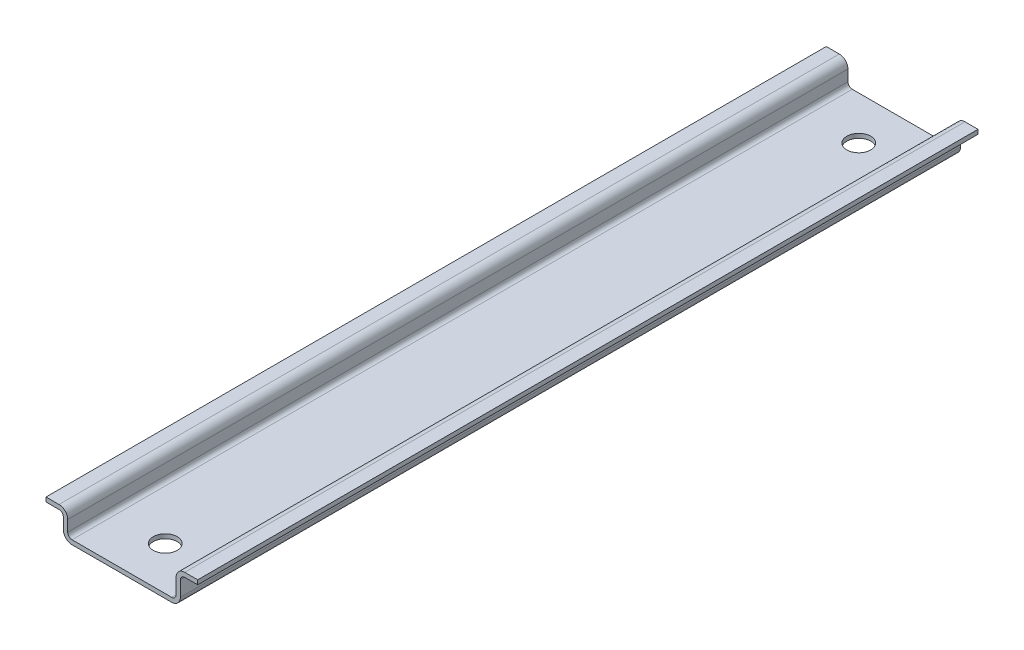
ISO-10303-21;
HEADER;
FILE_DESCRIPTION(('STEP AP214'),'2;1');
FILE_NAME('part.step','',(''),(''),'','','');
FILE_SCHEMA(('AUTOMOTIVE_DESIGN { 1 0 10303 214 1 1 1 1 }'));
ENDSEC;
DATA;
#1=APPLICATION_CONTEXT('core data for automotive mechanical design processes');
#2=APPLICATION_PROTOCOL_DEFINITION('international standard','automotive_design',2000,#1);
#3=PRODUCT_CONTEXT('',#1,'mechanical');
#4=PRODUCT('Part','Part','',(#3));
#5=PRODUCT_RELATED_PRODUCT_CATEGORY('part','',(#4));
#6=PRODUCT_DEFINITION_FORMATION('','',#4);
#7=PRODUCT_DEFINITION_CONTEXT('part definition',#1,'design');
#8=PRODUCT_DEFINITION('design','',#6,#7);
#9=PRODUCT_DEFINITION_SHAPE('','',#8);
#10=(LENGTH_UNIT() NAMED_UNIT(*) SI_UNIT(.MILLI.,.METRE.));
#11=(NAMED_UNIT(*) PLANE_ANGLE_UNIT() SI_UNIT($,.RADIAN.));
#12=(NAMED_UNIT(*) SI_UNIT($,.STERADIAN.) SOLID_ANGLE_UNIT());
#13=UNCERTAINTY_MEASURE_WITH_UNIT(LENGTH_MEASURE(1.E-05),#10,'distance_accuracy_value','');
#14=(GEOMETRIC_REPRESENTATION_CONTEXT(3) GLOBAL_UNCERTAINTY_ASSIGNED_CONTEXT((#13)) GLOBAL_UNIT_ASSIGNED_CONTEXT((#10,
#11,#12)) REPRESENTATION_CONTEXT('',''));
#15=CARTESIAN_POINT('',(0.,0.,0.));
#16=DIRECTION('',(0.,0.,1.));
#17=DIRECTION('',(1.,0.,0.));
#18=AXIS2_PLACEMENT_3D('',#15,#16,#17);
#19=CARTESIAN_POINT('',(-4.,5.54454071771809,180.));
#20=DIRECTION('',(1.,0.,0.));
#21=DIRECTION('',(0.,0.,-1.));
#22=AXIS2_PLACEMENT_3D('',#19,#20,#21);
#23=PLANE('',#22);
#24=DIRECTION('',(0.,-1.,0.));
#25=VECTOR('',#24,1.);
#26=CARTESIAN_POINT('',(-4.,5.54454071771809,0.));
#27=LINE('',#26,#25);
#28=CARTESIAN_POINT('',(-4.,6.54454071771809,0.));
#29=VERTEX_POINT('',#28);
#30=CARTESIAN_POINT('',(-4.,5.54454071771809,0.));
#31=VERTEX_POINT('',#30);
#32=EDGE_CURVE('E200',#29,#31,#27,.T.);
#33=ORIENTED_EDGE('',*,*,#32,.T.);
#34=DIRECTION('',(0.,0.,-1.));
#35=VECTOR('',#34,1.);
#36=CARTESIAN_POINT('',(-4.,5.54454071771809,180.));
#37=LINE('',#36,#35);
#38=CARTESIAN_POINT('',(-4.,5.54454071771809,180.));
#39=VERTEX_POINT('',#38);
#40=EDGE_CURVE('E11',#39,#31,#37,.T.);
#41=ORIENTED_EDGE('',*,*,#40,.F.);
#42=DIRECTION('',(0.,-1.,0.));
#43=VECTOR('',#42,1.);
#44=CARTESIAN_POINT('',(-4.,5.54454071771809,180.));
#45=LINE('',#44,#43);
#46=CARTESIAN_POINT('',(-4.,6.54454071771809,180.));
#47=VERTEX_POINT('',#46);
#48=EDGE_CURVE('E239',#47,#39,#45,.T.);
#49=ORIENTED_EDGE('',*,*,#48,.F.);
#50=DIRECTION('',(0.,0.,-1.));
#51=VECTOR('',#50,1.);
#52=CARTESIAN_POINT('',(-4.,6.54454071771809,180.));
#53=LINE('',#52,#51);
#54=EDGE_CURVE('E196',#47,#29,#53,.T.);
#55=ORIENTED_EDGE('',*,*,#54,.T.);
#56=EDGE_LOOP('',(#33,#41,#49,#55));
#57=FACE_BOUND('',#56,.T.);
#58=ADVANCED_FACE('F32',(#57),#23,.F.);
#59=CARTESIAN_POINT('',(-1.00000000000001,5.54454071771809,180.));
#60=DIRECTION('',(0.,1.,0.));
#61=DIRECTION('',(-1.,0.,0.));
#62=AXIS2_PLACEMENT_3D('',#59,#60,#61);
#63=PLANE('',#62);
#64=DIRECTION('',(1.,0.,0.));
#65=VECTOR('',#64,1.);
#66=CARTESIAN_POINT('',(-1.00000000000001,5.54454071771809,0.));
#67=LINE('',#66,#65);
#68=CARTESIAN_POINT('',(-1.00000000000001,5.54454071771809,0.));
#69=VERTEX_POINT('',#68);
#70=EDGE_CURVE('E203',#31,#69,#67,.T.);
#71=ORIENTED_EDGE('',*,*,#70,.T.);
#72=DIRECTION('',(0.,0.,-1.));
#73=VECTOR('',#72,1.);
#74=CARTESIAN_POINT('',(-1.00000000000001,5.54454071771809,180.));
#75=LINE('',#74,#73);
#76=CARTESIAN_POINT('',(-1.00000000000001,5.54454071771809,180.));
#77=VERTEX_POINT('',#76);
#78=EDGE_CURVE('E40',#77,#69,#75,.T.);
#79=ORIENTED_EDGE('',*,*,#78,.F.);
#80=DIRECTION('',(1.,0.,0.));
#81=VECTOR('',#80,1.);
#82=CARTESIAN_POINT('',(-1.00000000000001,5.54454071771809,180.));
#83=LINE('',#82,#81);
#84=EDGE_CURVE('E127',#39,#77,#83,.T.);
#85=ORIENTED_EDGE('',*,*,#84,.F.);
#86=ORIENTED_EDGE('',*,*,#40,.T.);
#87=EDGE_LOOP('',(#71,#79,#85,#86));
#88=FACE_BOUND('',#87,.T.);
#89=ADVANCED_FACE('F357',(#88),#63,.F.);
#90=CARTESIAN_POINT('',(-1.,4.54454071771809,180.));
#91=DIRECTION('',(0.,0.,-1.));
#92=DIRECTION('',(-1.,0.,0.));
#93=AXIS2_PLACEMENT_3D('',#90,#91,#92);
#94=CYLINDRICAL_SURFACE('',#93,1.);
#95=CARTESIAN_POINT('',(-1.,4.54454071771809,0.));
#96=DIRECTION('',(0.,0.,-1.));
#97=DIRECTION('',(1.,0.,0.));
#98=AXIS2_PLACEMENT_3D('',#95,#96,#97);
#99=CIRCLE('',#98,1.);
#100=CARTESIAN_POINT('',(0.,4.54454071771808,0.));
#101=VERTEX_POINT('',#100);
#102=EDGE_CURVE('E206',#69,#101,#99,.T.);
#103=ORIENTED_EDGE('',*,*,#102,.T.);
#104=DIRECTION('',(0.,0.,-1.));
#105=VECTOR('',#104,1.);
#106=CARTESIAN_POINT('',(0.,4.54454071771808,180.));
#107=LINE('',#106,#105);
#108=CARTESIAN_POINT('',(0.,4.54454071771808,180.));
#109=VERTEX_POINT('',#108);
#110=EDGE_CURVE('E282',#109,#101,#107,.T.);
#111=ORIENTED_EDGE('',*,*,#110,.F.);
#112=CARTESIAN_POINT('',(-1.,4.54454071771809,180.));
#113=DIRECTION('',(0.,0.,-1.));
#114=DIRECTION('',(1.,0.,0.));
#115=AXIS2_PLACEMENT_3D('',#112,#113,#114);
#116=CIRCLE('',#115,1.);
#117=EDGE_CURVE('E290',#77,#109,#116,.T.);
#118=ORIENTED_EDGE('',*,*,#117,.F.);
#119=ORIENTED_EDGE('',*,*,#78,.T.);
#120=EDGE_LOOP('',(#103,#111,#118,#119));
#121=FACE_BOUND('',#120,.T.);
#122=ADVANCED_FACE('F288',(#121),#94,.F.);
#123=CARTESIAN_POINT('',(0.,2.00000000000001,180.));
#124=DIRECTION('',(1.,0.,0.));
#125=DIRECTION('',(0.,0.,-1.));
#126=AXIS2_PLACEMENT_3D('',#123,#124,#125);
#127=PLANE('',#126);
#128=DIRECTION('',(0.,-1.,0.));
#129=VECTOR('',#128,1.);
#130=CARTESIAN_POINT('',(0.,2.00000000000001,0.));
#131=LINE('',#130,#129);
#132=CARTESIAN_POINT('',(0.,2.00000000000001,0.));
#133=VERTEX_POINT('',#132);
#134=EDGE_CURVE('E208',#101,#133,#131,.T.);
#135=ORIENTED_EDGE('',*,*,#134,.T.);
#136=DIRECTION('',(0.,0.,-1.));
#137=VECTOR('',#136,1.);
#138=CARTESIAN_POINT('',(0.,2.00000000000001,180.));
#139=LINE('',#138,#137);
#140=CARTESIAN_POINT('',(0.,2.00000000000001,180.));
#141=VERTEX_POINT('',#140);
#142=EDGE_CURVE('E279',#141,#133,#139,.T.);
#143=ORIENTED_EDGE('',*,*,#142,.F.);
#144=DIRECTION('',(0.,-1.,0.));
#145=VECTOR('',#144,1.);
#146=CARTESIAN_POINT('',(0.,2.00000000000001,180.));
#147=LINE('',#146,#145);
#148=EDGE_CURVE('E308',#109,#141,#147,.T.);
#149=ORIENTED_EDGE('',*,*,#148,.F.);
#150=ORIENTED_EDGE('',*,*,#110,.T.);
#151=EDGE_LOOP('',(#135,#143,#149,#150));
#152=FACE_BOUND('',#151,.T.);
#153=ADVANCED_FACE('F299',(#152),#127,.F.);
#154=CARTESIAN_POINT('',(2.,2.,180.));
#155=DIRECTION('',(0.,0.,-1.));
#156=DIRECTION('',(-1.,0.,0.));
#157=AXIS2_PLACEMENT_3D('',#154,#155,#156);
#158=CYLINDRICAL_SURFACE('',#157,2.);
#159=CARTESIAN_POINT('',(2.,2.,0.));
#160=DIRECTION('',(0.,0.,1.));
#161=DIRECTION('',(-1.,0.,0.));
#162=AXIS2_PLACEMENT_3D('',#159,#160,#161);
#163=CIRCLE('',#162,2.);
#164=CARTESIAN_POINT('',(2.00000000000001,0.,0.));
#165=VERTEX_POINT('',#164);
#166=EDGE_CURVE('E210',#133,#165,#163,.T.);
#167=ORIENTED_EDGE('',*,*,#166,.T.);
#168=DIRECTION('',(0.,0.,-1.));
#169=VECTOR('',#168,1.);
#170=CARTESIAN_POINT('',(2.00000000000001,0.,180.));
#171=LINE('',#170,#169);
#172=CARTESIAN_POINT('',(2.00000000000001,0.,180.));
#173=VERTEX_POINT('',#172);
#174=EDGE_CURVE('E276',#173,#165,#171,.T.);
#175=ORIENTED_EDGE('',*,*,#174,.F.);
#176=CARTESIAN_POINT('',(2.,2.,180.));
#177=DIRECTION('',(0.,0.,1.));
#178=DIRECTION('',(-1.,0.,0.));
#179=AXIS2_PLACEMENT_3D('',#176,#177,#178);
#180=CIRCLE('',#179,2.);
#181=EDGE_CURVE('E305',#141,#173,#180,.T.);
#182=ORIENTED_EDGE('',*,*,#181,.F.);
#183=ORIENTED_EDGE('',*,*,#142,.T.);
#184=EDGE_LOOP('',(#167,#175,#182,#183));
#185=FACE_BOUND('',#184,.T.);
#186=ADVANCED_FACE('F303',(#185),#158,.T.);
#187=CARTESIAN_POINT('',(2.00000000000001,0.,180.));
#188=DIRECTION('',(0.,1.,0.));
#189=DIRECTION('',(0.,0.,1.));
#190=AXIS2_PLACEMENT_3D('',#187,#188,#189);
#191=PLANE('',#190);
#192=CARTESIAN_POINT('',(13.5,0.,170.));
#193=DIRECTION('',(0.,1.,0.));
#194=DIRECTION('',(0.,0.,1.));
#195=AXIS2_PLACEMENT_3D('',#192,#193,#194);
#196=CIRCLE('',#195,2.75);
#197=CARTESIAN_POINT('',(13.5,0.,172.75));
#198=VERTEX_POINT('',#197);
#199=EDGE_CURVE('E484',#198,#198,#196,.T.);
#200=ORIENTED_EDGE('',*,*,#199,.T.);
#201=EDGE_LOOP('',(#200));
#202=FACE_BOUND('',#201,.T.);
#203=CARTESIAN_POINT('',(13.5,0.,10.));
#204=DIRECTION('',(0.,1.,0.));
#205=DIRECTION('',(0.,0.,1.));
#206=AXIS2_PLACEMENT_3D('',#203,#204,#205);
#207=CIRCLE('',#206,2.75);
#208=CARTESIAN_POINT('',(13.5,0.,12.75));
#209=VERTEX_POINT('',#208);
#210=EDGE_CURVE('E204',#209,#209,#207,.T.);
#211=ORIENTED_EDGE('',*,*,#210,.T.);
#212=EDGE_LOOP('',(#211));
#213=FACE_BOUND('',#212,.T.);
#214=DIRECTION('',(1.,0.,0.));
#215=VECTOR('',#214,1.);
#216=CARTESIAN_POINT('',(2.00000000000001,0.,0.));
#217=LINE('',#216,#215);
#218=CARTESIAN_POINT('',(25.,0.,0.));
#219=VERTEX_POINT('',#218);
#220=EDGE_CURVE('E212',#165,#219,#217,.T.);
#221=ORIENTED_EDGE('',*,*,#220,.T.);
#222=DIRECTION('',(0.,0.,-1.));
#223=VECTOR('',#222,1.);
#224=CARTESIAN_POINT('',(25.,0.,180.));
#225=LINE('',#224,#223);
#226=CARTESIAN_POINT('',(25.,0.,180.));
#227=VERTEX_POINT('',#226);
#228=EDGE_CURVE('E273',#227,#219,#225,.T.);
#229=ORIENTED_EDGE('',*,*,#228,.F.);
#230=DIRECTION('',(1.,0.,0.));
#231=VECTOR('',#230,1.);
#232=CARTESIAN_POINT('',(2.00000000000001,0.,180.));
#233=LINE('',#232,#231);
#234=EDGE_CURVE('E307',#173,#227,#233,.T.);
#235=ORIENTED_EDGE('',*,*,#234,.F.);
#236=ORIENTED_EDGE('',*,*,#174,.T.);
#237=EDGE_LOOP('',(#221,#229,#235,#236));
#238=FACE_BOUND('',#237,.T.);
#239=ADVANCED_FACE('F370',(#202,#213,#238),#191,.F.);
#240=CARTESIAN_POINT('',(25.,2.,180.));
#241=DIRECTION('',(0.,0.,-1.));
#242=DIRECTION('',(-1.,0.,0.));
#243=AXIS2_PLACEMENT_3D('',#240,#241,#242);
#244=CYLINDRICAL_SURFACE('',#243,2.);
#245=CARTESIAN_POINT('',(25.,2.,0.));
#246=DIRECTION('',(0.,0.,1.));
#247=DIRECTION('',(1.,0.,0.));
#248=AXIS2_PLACEMENT_3D('',#245,#246,#247);
#249=CIRCLE('',#248,2.);
#250=CARTESIAN_POINT('',(27.,2.,0.));
#251=VERTEX_POINT('',#250);
#252=EDGE_CURVE('E214',#219,#251,#249,.T.);
#253=ORIENTED_EDGE('',*,*,#252,.T.);
#254=DIRECTION('',(0.,0.,-1.));
#255=VECTOR('',#254,1.);
#256=CARTESIAN_POINT('',(27.,2.,180.));
#257=LINE('',#256,#255);
#258=CARTESIAN_POINT('',(27.,2.,180.));
#259=VERTEX_POINT('',#258);
#260=EDGE_CURVE('E270',#259,#251,#257,.T.);
#261=ORIENTED_EDGE('',*,*,#260,.F.);
#262=CARTESIAN_POINT('',(25.,2.,180.));
#263=DIRECTION('',(0.,0.,1.));
#264=DIRECTION('',(1.,0.,0.));
#265=AXIS2_PLACEMENT_3D('',#262,#263,#264);
#266=CIRCLE('',#265,2.);
#267=EDGE_CURVE('E310',#227,#259,#266,.T.);
#268=ORIENTED_EDGE('',*,*,#267,.F.);
#269=ORIENTED_EDGE('',*,*,#228,.T.);
#270=EDGE_LOOP('',(#253,#261,#268,#269));
#271=FACE_BOUND('',#270,.T.);
#272=ADVANCED_FACE('F373',(#271),#244,.T.);
#273=CARTESIAN_POINT('',(27.,2.00000000000001,180.));
#274=DIRECTION('',(-1.,0.,0.));
#275=DIRECTION('',(0.,0.,1.));
#276=AXIS2_PLACEMENT_3D('',#273,#274,#275);
#277=PLANE('',#276);
#278=DIRECTION('',(0.,1.,0.));
#279=VECTOR('',#278,1.);
#280=CARTESIAN_POINT('',(27.,2.00000000000001,0.));
#281=LINE('',#280,#279);
#282=CARTESIAN_POINT('',(27.,5.49999999999999,0.));
#283=VERTEX_POINT('',#282);
#284=EDGE_CURVE('E216',#251,#283,#281,.T.);
#285=ORIENTED_EDGE('',*,*,#284,.T.);
#286=DIRECTION('',(0.,0.,-1.));
#287=VECTOR('',#286,1.);
#288=CARTESIAN_POINT('',(27.,5.49999999999999,180.));
#289=LINE('',#288,#287);
#290=CARTESIAN_POINT('',(27.,5.49999999999999,180.));
#291=VERTEX_POINT('',#290);
#292=EDGE_CURVE('E267',#291,#283,#289,.T.);
#293=ORIENTED_EDGE('',*,*,#292,.F.);
#294=DIRECTION('',(0.,1.,0.));
#295=VECTOR('',#294,1.);
#296=CARTESIAN_POINT('',(27.,2.00000000000001,180.));
#297=LINE('',#296,#295);
#298=EDGE_CURVE('E316',#259,#291,#297,.T.);
#299=ORIENTED_EDGE('',*,*,#298,.F.);
#300=ORIENTED_EDGE('',*,*,#260,.T.);
#301=EDGE_LOOP('',(#285,#293,#299,#300));
#302=FACE_BOUND('',#301,.T.);
#303=ADVANCED_FACE('F377',(#302),#277,.F.);
#304=CARTESIAN_POINT('',(28.,5.5,180.));
#305=DIRECTION('',(0.,0.,-1.));
#306=DIRECTION('',(-1.,0.,0.));
#307=AXIS2_PLACEMENT_3D('',#304,#305,#306);
#308=CYLINDRICAL_SURFACE('',#307,1.);
#309=CARTESIAN_POINT('',(28.,5.5,0.));
#310=DIRECTION('',(0.,0.,-1.));
#311=DIRECTION('',(-1.,0.,0.));
#312=AXIS2_PLACEMENT_3D('',#309,#310,#311);
#313=CIRCLE('',#312,1.);
#314=CARTESIAN_POINT('',(28.,6.5,0.));
#315=VERTEX_POINT('',#314);
#316=EDGE_CURVE('E218',#283,#315,#313,.T.);
#317=ORIENTED_EDGE('',*,*,#316,.T.);
#318=DIRECTION('',(0.,0.,-1.));
#319=VECTOR('',#318,1.);
#320=CARTESIAN_POINT('',(28.,6.5,180.));
#321=LINE('',#320,#319);
#322=CARTESIAN_POINT('',(28.,6.5,180.));
#323=VERTEX_POINT('',#322);
#324=EDGE_CURVE('E264',#323,#315,#321,.T.);
#325=ORIENTED_EDGE('',*,*,#324,.F.);
#326=CARTESIAN_POINT('',(28.,5.5,180.));
#327=DIRECTION('',(0.,0.,-1.));
#328=DIRECTION('',(-1.,0.,0.));
#329=AXIS2_PLACEMENT_3D('',#326,#327,#328);
#330=CIRCLE('',#329,1.);
#331=EDGE_CURVE('E318',#291,#323,#330,.T.);
#332=ORIENTED_EDGE('',*,*,#331,.F.);
#333=ORIENTED_EDGE('',*,*,#292,.T.);
#334=EDGE_LOOP('',(#317,#325,#332,#333));
#335=FACE_BOUND('',#334,.T.);
#336=ADVANCED_FACE('F381',(#335),#308,.F.);
#337=CARTESIAN_POINT('',(28.,6.5,180.));
#338=DIRECTION('',(0.,1.,0.));
#339=DIRECTION('',(-1.,0.,0.));
#340=AXIS2_PLACEMENT_3D('',#337,#338,#339);
#341=PLANE('',#340);
#342=DIRECTION('',(1.,0.,0.));
#343=VECTOR('',#342,1.);
#344=CARTESIAN_POINT('',(28.,6.5,0.));
#345=LINE('',#344,#343);
#346=CARTESIAN_POINT('',(31.,6.5,0.));
#347=VERTEX_POINT('',#346);
#348=EDGE_CURVE('E220',#315,#347,#345,.T.);
#349=ORIENTED_EDGE('',*,*,#348,.T.);
#350=DIRECTION('',(0.,0.,-1.));
#351=VECTOR('',#350,1.);
#352=CARTESIAN_POINT('',(31.,6.5,180.));
#353=LINE('',#352,#351);
#354=CARTESIAN_POINT('',(31.,6.5,180.));
#355=VERTEX_POINT('',#354);
#356=EDGE_CURVE('E261',#355,#347,#353,.T.);
#357=ORIENTED_EDGE('',*,*,#356,.F.);
#358=DIRECTION('',(1.,0.,0.));
#359=VECTOR('',#358,1.);
#360=CARTESIAN_POINT('',(28.,6.5,180.));
#361=LINE('',#360,#359);
#362=EDGE_CURVE('E320',#323,#355,#361,.T.);
#363=ORIENTED_EDGE('',*,*,#362,.F.);
#364=ORIENTED_EDGE('',*,*,#324,.T.);
#365=EDGE_LOOP('',(#349,#357,#363,#364));
#366=FACE_BOUND('',#365,.T.);
#367=ADVANCED_FACE('F385',(#366),#341,.F.);
#368=CARTESIAN_POINT('',(31.,6.5,180.));
#369=DIRECTION('',(-1.,0.,0.));
#370=DIRECTION('',(0.,0.,1.));
#371=AXIS2_PLACEMENT_3D('',#368,#369,#370);
#372=PLANE('',#371);
#373=DIRECTION('',(0.,1.,0.));
#374=VECTOR('',#373,1.);
#375=CARTESIAN_POINT('',(31.,6.5,0.));
#376=LINE('',#375,#374);
#377=CARTESIAN_POINT('',(31.,7.5,0.));
#378=VERTEX_POINT('',#377);
#379=EDGE_CURVE('E222',#347,#378,#376,.T.);
#380=ORIENTED_EDGE('',*,*,#379,.T.);
#381=DIRECTION('',(0.,0.,-1.));
#382=VECTOR('',#381,1.);
#383=CARTESIAN_POINT('',(31.,7.5,180.));
#384=LINE('',#383,#382);
#385=CARTESIAN_POINT('',(31.,7.5,180.));
#386=VERTEX_POINT('',#385);
#387=EDGE_CURVE('E258',#386,#378,#384,.T.);
#388=ORIENTED_EDGE('',*,*,#387,.F.);
#389=DIRECTION('',(0.,1.,0.));
#390=VECTOR('',#389,1.);
#391=CARTESIAN_POINT('',(31.,6.5,180.));
#392=LINE('',#391,#390);
#393=EDGE_CURVE('E322',#355,#386,#392,.T.);
#394=ORIENTED_EDGE('',*,*,#393,.F.);
#395=ORIENTED_EDGE('',*,*,#356,.T.);
#396=EDGE_LOOP('',(#380,#388,#394,#395));
#397=FACE_BOUND('',#396,.T.);
#398=ADVANCED_FACE('F389',(#397),#372,.F.);
#399=CARTESIAN_POINT('',(28.,7.5,180.));
#400=DIRECTION('',(0.,-1.,0.));
#401=DIRECTION('',(0.,0.,-1.));
#402=AXIS2_PLACEMENT_3D('',#399,#400,#401);
#403=PLANE('',#402);
#404=DIRECTION('',(-1.,0.,0.));
#405=VECTOR('',#404,1.);
#406=CARTESIAN_POINT('',(28.,7.5,0.));
#407=LINE('',#406,#405);
#408=CARTESIAN_POINT('',(28.,7.5,0.));
#409=VERTEX_POINT('',#408);
#410=EDGE_CURVE('E224',#378,#409,#407,.T.);
#411=ORIENTED_EDGE('',*,*,#410,.T.);
#412=DIRECTION('',(0.,0.,-1.));
#413=VECTOR('',#412,1.);
#414=CARTESIAN_POINT('',(28.,7.5,180.));
#415=LINE('',#414,#413);
#416=CARTESIAN_POINT('',(28.,7.5,180.));
#417=VERTEX_POINT('',#416);
#418=EDGE_CURVE('E255',#417,#409,#415,.T.);
#419=ORIENTED_EDGE('',*,*,#418,.F.);
#420=DIRECTION('',(-1.,0.,0.));
#421=VECTOR('',#420,1.);
#422=CARTESIAN_POINT('',(28.,7.5,180.));
#423=LINE('',#422,#421);
#424=EDGE_CURVE('E324',#386,#417,#423,.T.);
#425=ORIENTED_EDGE('',*,*,#424,.F.);
#426=ORIENTED_EDGE('',*,*,#387,.T.);
#427=EDGE_LOOP('',(#411,#419,#425,#426));
#428=FACE_BOUND('',#427,.T.);
#429=ADVANCED_FACE('F393',(#428),#403,.F.);
#430=CARTESIAN_POINT('',(28.,5.5,180.));
#431=DIRECTION('',(0.,0.,-1.));
#432=DIRECTION('',(-1.,0.,0.));
#433=AXIS2_PLACEMENT_3D('',#430,#431,#432);
#434=CYLINDRICAL_SURFACE('',#433,2.);
#435=CARTESIAN_POINT('',(28.,5.5,0.));
#436=DIRECTION('',(0.,0.,1.));
#437=DIRECTION('',(-1.,0.,0.));
#438=AXIS2_PLACEMENT_3D('',#435,#436,#437);
#439=CIRCLE('',#438,2.);
#440=CARTESIAN_POINT('',(26.,5.49999999999999,0.));
#441=VERTEX_POINT('',#440);
#442=EDGE_CURVE('E226',#409,#441,#439,.T.);
#443=ORIENTED_EDGE('',*,*,#442,.T.);
#444=DIRECTION('',(0.,0.,-1.));
#445=VECTOR('',#444,1.);
#446=CARTESIAN_POINT('',(26.,5.49999999999999,180.));
#447=LINE('',#446,#445);
#448=CARTESIAN_POINT('',(26.,5.49999999999999,180.));
#449=VERTEX_POINT('',#448);
#450=EDGE_CURVE('E252',#449,#441,#447,.T.);
#451=ORIENTED_EDGE('',*,*,#450,.F.);
#452=CARTESIAN_POINT('',(28.,5.5,180.));
#453=DIRECTION('',(0.,0.,1.));
#454=DIRECTION('',(-1.,0.,0.));
#455=AXIS2_PLACEMENT_3D('',#452,#453,#454);
#456=CIRCLE('',#455,2.);
#457=EDGE_CURVE('E326',#417,#449,#456,.T.);
#458=ORIENTED_EDGE('',*,*,#457,.F.);
#459=ORIENTED_EDGE('',*,*,#418,.T.);
#460=EDGE_LOOP('',(#443,#451,#458,#459));
#461=FACE_BOUND('',#460,.T.);
#462=ADVANCED_FACE('F397',(#461),#434,.T.);
#463=CARTESIAN_POINT('',(26.,2.00000000000001,180.));
#464=DIRECTION('',(1.,0.,0.));
#465=DIRECTION('',(0.,0.,-1.));
#466=AXIS2_PLACEMENT_3D('',#463,#464,#465);
#467=PLANE('',#466);
#468=DIRECTION('',(0.,-1.,0.));
#469=VECTOR('',#468,1.);
#470=CARTESIAN_POINT('',(26.,2.00000000000001,0.));
#471=LINE('',#470,#469);
#472=CARTESIAN_POINT('',(26.,2.00000000000001,0.));
#473=VERTEX_POINT('',#472);
#474=EDGE_CURVE('E228',#441,#473,#471,.T.);
#475=ORIENTED_EDGE('',*,*,#474,.T.);
#476=DIRECTION('',(0.,0.,-1.));
#477=VECTOR('',#476,1.);
#478=CARTESIAN_POINT('',(26.,2.00000000000001,180.));
#479=LINE('',#478,#477);
#480=CARTESIAN_POINT('',(26.,2.00000000000001,180.));
#481=VERTEX_POINT('',#480);
#482=EDGE_CURVE('E249',#481,#473,#479,.T.);
#483=ORIENTED_EDGE('',*,*,#482,.F.);
#484=DIRECTION('',(0.,-1.,0.));
#485=VECTOR('',#484,1.);
#486=CARTESIAN_POINT('',(26.,2.00000000000001,180.));
#487=LINE('',#486,#485);
#488=EDGE_CURVE('E328',#449,#481,#487,.T.);
#489=ORIENTED_EDGE('',*,*,#488,.F.);
#490=ORIENTED_EDGE('',*,*,#450,.T.);
#491=EDGE_LOOP('',(#475,#483,#489,#490));
#492=FACE_BOUND('',#491,.T.);
#493=ADVANCED_FACE('F401',(#492),#467,.F.);
#494=CARTESIAN_POINT('',(25.,2.,180.));
#495=DIRECTION('',(0.,0.,-1.));
#496=DIRECTION('',(-1.,0.,0.));
#497=AXIS2_PLACEMENT_3D('',#494,#495,#496);
#498=CYLINDRICAL_SURFACE('',#497,1.);
#499=CARTESIAN_POINT('',(25.,2.,0.));
#500=DIRECTION('',(0.,0.,-1.));
#501=DIRECTION('',(1.,0.,0.));
#502=AXIS2_PLACEMENT_3D('',#499,#500,#501);
#503=CIRCLE('',#502,1.);
#504=CARTESIAN_POINT('',(25.,1.,0.));
#505=VERTEX_POINT('',#504);
#506=EDGE_CURVE('E230',#473,#505,#503,.T.);
#507=ORIENTED_EDGE('',*,*,#506,.T.);
#508=DIRECTION('',(0.,0.,-1.));
#509=VECTOR('',#508,1.);
#510=CARTESIAN_POINT('',(25.,1.,180.));
#511=LINE('',#510,#509);
#512=CARTESIAN_POINT('',(25.,1.,180.));
#513=VERTEX_POINT('',#512);
#514=EDGE_CURVE('E246',#513,#505,#511,.T.);
#515=ORIENTED_EDGE('',*,*,#514,.F.);
#516=CARTESIAN_POINT('',(25.,2.,180.));
#517=DIRECTION('',(0.,0.,-1.));
#518=DIRECTION('',(1.,0.,0.));
#519=AXIS2_PLACEMENT_3D('',#516,#517,#518);
#520=CIRCLE('',#519,1.);
#521=EDGE_CURVE('E330',#481,#513,#520,.T.);
#522=ORIENTED_EDGE('',*,*,#521,.F.);
#523=ORIENTED_EDGE('',*,*,#482,.T.);
#524=EDGE_LOOP('',(#507,#515,#522,#523));
#525=FACE_BOUND('',#524,.T.);
#526=ADVANCED_FACE('F405',(#525),#498,.F.);
#527=CARTESIAN_POINT('',(2.00000000000001,1.,180.));
#528=DIRECTION('',(0.,-1.,0.));
#529=DIRECTION('',(0.,0.,-1.));
#530=AXIS2_PLACEMENT_3D('',#527,#528,#529);
#531=PLANE('',#530);
#532=CARTESIAN_POINT('',(13.5,1.,170.));
#533=DIRECTION('',(0.,1.,0.));
#534=DIRECTION('',(0.,0.,1.));
#535=AXIS2_PLACEMENT_3D('',#532,#533,#534);
#536=CIRCLE('',#535,2.75);
#537=CARTESIAN_POINT('',(13.5,1.,172.75));
#538=VERTEX_POINT('',#537);
#539=EDGE_CURVE('E487',#538,#538,#536,.T.);
#540=ORIENTED_EDGE('',*,*,#539,.F.);
#541=EDGE_LOOP('',(#540));
#542=FACE_BOUND('',#541,.T.);
#543=CARTESIAN_POINT('',(13.5,1.,10.));
#544=DIRECTION('',(0.,1.,0.));
#545=DIRECTION('',(0.,0.,1.));
#546=AXIS2_PLACEMENT_3D('',#543,#544,#545);
#547=CIRCLE('',#546,2.75);
#548=CARTESIAN_POINT('',(13.5,1.,12.75));
#549=VERTEX_POINT('',#548);
#550=EDGE_CURVE('E489',#549,#549,#547,.T.);
#551=ORIENTED_EDGE('',*,*,#550,.F.);
#552=EDGE_LOOP('',(#551));
#553=FACE_BOUND('',#552,.T.);
#554=DIRECTION('',(-1.,0.,0.));
#555=VECTOR('',#554,1.);
#556=CARTESIAN_POINT('',(2.00000000000001,1.,0.));
#557=LINE('',#556,#555);
#558=CARTESIAN_POINT('',(2.00000000000001,1.,0.));
#559=VERTEX_POINT('',#558);
#560=EDGE_CURVE('E232',#505,#559,#557,.T.);
#561=ORIENTED_EDGE('',*,*,#560,.T.);
#562=DIRECTION('',(0.,0.,-1.));
#563=VECTOR('',#562,1.);
#564=CARTESIAN_POINT('',(2.00000000000001,1.,180.));
#565=LINE('',#564,#563);
#566=CARTESIAN_POINT('',(2.00000000000001,1.,180.));
#567=VERTEX_POINT('',#566);
#568=EDGE_CURVE('E243',#567,#559,#565,.T.);
#569=ORIENTED_EDGE('',*,*,#568,.F.);
#570=DIRECTION('',(-1.,0.,0.));
#571=VECTOR('',#570,1.);
#572=CARTESIAN_POINT('',(2.00000000000001,1.,180.));
#573=LINE('',#572,#571);
#574=EDGE_CURVE('E332',#513,#567,#573,.T.);
#575=ORIENTED_EDGE('',*,*,#574,.F.);
#576=ORIENTED_EDGE('',*,*,#514,.T.);
#577=EDGE_LOOP('',(#561,#569,#575,#576));
#578=FACE_BOUND('',#577,.T.);
#579=ADVANCED_FACE('F338',(#542,#553,#578),#531,.F.);
#580=CARTESIAN_POINT('',(2.,2.,180.));
#581=DIRECTION('',(0.,0.,-1.));
#582=DIRECTION('',(-1.,0.,0.));
#583=AXIS2_PLACEMENT_3D('',#580,#581,#582);
#584=CYLINDRICAL_SURFACE('',#583,1.);
#585=CARTESIAN_POINT('',(2.,2.,0.));
#586=DIRECTION('',(0.,0.,-1.));
#587=DIRECTION('',(1.,0.,0.));
#588=AXIS2_PLACEMENT_3D('',#585,#586,#587);
#589=CIRCLE('',#588,1.);
#590=CARTESIAN_POINT('',(1.,2.00000000000001,0.));
#591=VERTEX_POINT('',#590);
#592=EDGE_CURVE('E234',#559,#591,#589,.T.);
#593=ORIENTED_EDGE('',*,*,#592,.T.);
#594=DIRECTION('',(0.,0.,-1.));
#595=VECTOR('',#594,1.);
#596=CARTESIAN_POINT('',(1.,2.00000000000001,180.));
#597=LINE('',#596,#595);
#598=CARTESIAN_POINT('',(1.,2.00000000000001,180.));
#599=VERTEX_POINT('',#598);
#600=EDGE_CURVE('E191',#599,#591,#597,.T.);
#601=ORIENTED_EDGE('',*,*,#600,.F.);
#602=CARTESIAN_POINT('',(2.,2.,180.));
#603=DIRECTION('',(0.,0.,-1.));
#604=DIRECTION('',(1.,0.,0.));
#605=AXIS2_PLACEMENT_3D('',#602,#603,#604);
#606=CIRCLE('',#605,1.);
#607=EDGE_CURVE('E182',#567,#599,#606,.T.);
#608=ORIENTED_EDGE('',*,*,#607,.F.);
#609=ORIENTED_EDGE('',*,*,#568,.T.);
#610=EDGE_LOOP('',(#593,#601,#608,#609));
#611=FACE_BOUND('',#610,.T.);
#612=ADVANCED_FACE('F342',(#611),#584,.F.);
#613=CARTESIAN_POINT('',(1.,2.00000000000001,180.));
#614=DIRECTION('',(-1.,0.,0.));
#615=DIRECTION('',(0.,0.,1.));
#616=AXIS2_PLACEMENT_3D('',#613,#614,#615);
#617=PLANE('',#616);
#618=DIRECTION('',(0.,1.,0.));
#619=VECTOR('',#618,1.);
#620=CARTESIAN_POINT('',(1.,2.00000000000001,0.));
#621=LINE('',#620,#619);
#622=CARTESIAN_POINT('',(1.,4.54454071771807,0.));
#623=VERTEX_POINT('',#622);
#624=EDGE_CURVE('E190',#591,#623,#621,.T.);
#625=ORIENTED_EDGE('',*,*,#624,.T.);
#626=DIRECTION('',(0.,0.,-1.));
#627=VECTOR('',#626,1.);
#628=CARTESIAN_POINT('',(1.,4.54454071771807,180.));
#629=LINE('',#628,#627);
#630=CARTESIAN_POINT('',(1.,4.54454071771807,180.));
#631=VERTEX_POINT('',#630);
#632=EDGE_CURVE('E187',#631,#623,#629,.T.);
#633=ORIENTED_EDGE('',*,*,#632,.F.);
#634=DIRECTION('',(0.,1.,0.));
#635=VECTOR('',#634,1.);
#636=CARTESIAN_POINT('',(1.,2.00000000000001,180.));
#637=LINE('',#636,#635);
#638=EDGE_CURVE('E176',#599,#631,#637,.T.);
#639=ORIENTED_EDGE('',*,*,#638,.F.);
#640=ORIENTED_EDGE('',*,*,#600,.T.);
#641=EDGE_LOOP('',(#625,#633,#639,#640));
#642=FACE_BOUND('',#641,.T.);
#643=ADVANCED_FACE('F188',(#642),#617,.F.);
#644=CARTESIAN_POINT('',(-1.,4.54454071771809,180.));
#645=DIRECTION('',(0.,0.,-1.));
#646=DIRECTION('',(-1.,0.,0.));
#647=AXIS2_PLACEMENT_3D('',#644,#645,#646);
#648=CYLINDRICAL_SURFACE('',#647,2.);
#649=CARTESIAN_POINT('',(-1.,4.54454071771809,0.));
#650=DIRECTION('',(0.,0.,1.));
#651=DIRECTION('',(-1.,0.,0.));
#652=AXIS2_PLACEMENT_3D('',#649,#650,#651);
#653=CIRCLE('',#652,2.);
#654=CARTESIAN_POINT('',(-1.00000000000001,6.54454071771809,0.));
#655=VERTEX_POINT('',#654);
#656=EDGE_CURVE('E113',#623,#655,#653,.T.);
#657=ORIENTED_EDGE('',*,*,#656,.T.);
#658=DIRECTION('',(0.,0.,-1.));
#659=VECTOR('',#658,1.);
#660=CARTESIAN_POINT('',(-1.00000000000001,6.54454071771809,180.));
#661=LINE('',#660,#659);
#662=CARTESIAN_POINT('',(-1.00000000000001,6.54454071771809,180.));
#663=VERTEX_POINT('',#662);
#664=EDGE_CURVE('E192',#663,#655,#661,.T.);
#665=ORIENTED_EDGE('',*,*,#664,.F.);
#666=CARTESIAN_POINT('',(-1.,4.54454071771809,180.));
#667=DIRECTION('',(0.,0.,1.));
#668=DIRECTION('',(-1.,0.,0.));
#669=AXIS2_PLACEMENT_3D('',#666,#667,#668);
#670=CIRCLE('',#669,2.);
#671=EDGE_CURVE('E180',#631,#663,#670,.T.);
#672=ORIENTED_EDGE('',*,*,#671,.F.);
#673=ORIENTED_EDGE('',*,*,#632,.T.);
#674=EDGE_LOOP('',(#657,#665,#672,#673));
#675=FACE_BOUND('',#674,.T.);
#676=ADVANCED_FACE('F194',(#675),#648,.T.);
#677=CARTESIAN_POINT('',(-1.00000000000001,6.54454071771809,180.));
#678=DIRECTION('',(0.,-1.,0.));
#679=DIRECTION('',(1.,0.,0.));
#680=AXIS2_PLACEMENT_3D('',#677,#678,#679);
#681=PLANE('',#680);
#682=DIRECTION('',(-1.,0.,0.));
#683=VECTOR('',#682,1.);
#684=CARTESIAN_POINT('',(-1.00000000000001,6.54454071771809,0.));
#685=LINE('',#684,#683);
#686=EDGE_CURVE('E119',#655,#29,#685,.T.);
#687=ORIENTED_EDGE('',*,*,#686,.T.);
#688=ORIENTED_EDGE('',*,*,#54,.F.);
#689=DIRECTION('',(-1.,0.,0.));
#690=VECTOR('',#689,1.);
#691=CARTESIAN_POINT('',(-1.00000000000001,6.54454071771809,180.));
#692=LINE('',#691,#690);
#693=EDGE_CURVE('E48',#663,#47,#692,.T.);
#694=ORIENTED_EDGE('',*,*,#693,.F.);
#695=ORIENTED_EDGE('',*,*,#664,.T.);
#696=EDGE_LOOP('',(#687,#688,#694,#695));
#697=FACE_BOUND('',#696,.T.);
#698=ADVANCED_FACE('F346',(#697),#681,.F.);
#699=CARTESIAN_POINT('',(-1.,4.54454071771809,180.));
#700=DIRECTION('',(0.,0.,-1.));
#701=DIRECTION('',(-1.,0.,0.));
#702=AXIS2_PLACEMENT_3D('',#699,#700,#701);
#703=PLANE('',#702);
#704=ORIENTED_EDGE('',*,*,#48,.T.);
#705=ORIENTED_EDGE('',*,*,#84,.T.);
#706=ORIENTED_EDGE('',*,*,#117,.T.);
#707=ORIENTED_EDGE('',*,*,#148,.T.);
#708=ORIENTED_EDGE('',*,*,#181,.T.);
#709=ORIENTED_EDGE('',*,*,#234,.T.);
#710=ORIENTED_EDGE('',*,*,#267,.T.);
#711=ORIENTED_EDGE('',*,*,#298,.T.);
#712=ORIENTED_EDGE('',*,*,#331,.T.);
#713=ORIENTED_EDGE('',*,*,#362,.T.);
#714=ORIENTED_EDGE('',*,*,#393,.T.);
#715=ORIENTED_EDGE('',*,*,#424,.T.);
#716=ORIENTED_EDGE('',*,*,#457,.T.);
#717=ORIENTED_EDGE('',*,*,#488,.T.);
#718=ORIENTED_EDGE('',*,*,#521,.T.);
#719=ORIENTED_EDGE('',*,*,#574,.T.);
#720=ORIENTED_EDGE('',*,*,#607,.T.);
#721=ORIENTED_EDGE('',*,*,#638,.T.);
#722=ORIENTED_EDGE('',*,*,#671,.T.);
#723=ORIENTED_EDGE('',*,*,#693,.T.);
#724=EDGE_LOOP('',(#704,#705,#706,#707,#708,#709,#710,#711,#712,#713,#714,#715,#716,#717,#718,
#719,#720,#721,#722,#723));
#725=FACE_BOUND('',#724,.T.);
#726=ADVANCED_FACE('F178',(#725),#703,.F.);
#727=CARTESIAN_POINT('',(-1.,4.54454071771809,0.));
#728=DIRECTION('',(0.,0.,-1.));
#729=DIRECTION('',(-1.,0.,0.));
#730=AXIS2_PLACEMENT_3D('',#727,#728,#729);
#731=PLANE('',#730);
#732=ORIENTED_EDGE('',*,*,#32,.F.);
#733=ORIENTED_EDGE('',*,*,#686,.F.);
#734=ORIENTED_EDGE('',*,*,#656,.F.);
#735=ORIENTED_EDGE('',*,*,#624,.F.);
#736=ORIENTED_EDGE('',*,*,#592,.F.);
#737=ORIENTED_EDGE('',*,*,#560,.F.);
#738=ORIENTED_EDGE('',*,*,#506,.F.);
#739=ORIENTED_EDGE('',*,*,#474,.F.);
#740=ORIENTED_EDGE('',*,*,#442,.F.);
#741=ORIENTED_EDGE('',*,*,#410,.F.);
#742=ORIENTED_EDGE('',*,*,#379,.F.);
#743=ORIENTED_EDGE('',*,*,#348,.F.);
#744=ORIENTED_EDGE('',*,*,#316,.F.);
#745=ORIENTED_EDGE('',*,*,#284,.F.);
#746=ORIENTED_EDGE('',*,*,#252,.F.);
#747=ORIENTED_EDGE('',*,*,#220,.F.);
#748=ORIENTED_EDGE('',*,*,#166,.F.);
#749=ORIENTED_EDGE('',*,*,#134,.F.);
#750=ORIENTED_EDGE('',*,*,#102,.F.);
#751=ORIENTED_EDGE('',*,*,#70,.F.);
#752=EDGE_LOOP('',(#732,#733,#734,#735,#736,#737,#738,#739,#740,#741,#742,#743,#744,#745,#746,
#747,#748,#749,#750,#751));
#753=FACE_BOUND('',#752,.T.);
#754=ADVANCED_FACE('F294',(#753),#731,.T.);
#755=CARTESIAN_POINT('',(13.5,0.,10.));
#756=DIRECTION('',(0.,1.,0.));
#757=DIRECTION('',(0.,0.,1.));
#758=AXIS2_PLACEMENT_3D('',#755,#756,#757);
#759=CYLINDRICAL_SURFACE('',#758,2.75);
#760=ORIENTED_EDGE('',*,*,#210,.F.);
#761=EDGE_LOOP('',(#760));
#762=FACE_BOUND('',#761,.T.);
#763=ORIENTED_EDGE('',*,*,#550,.T.);
#764=EDGE_LOOP('',(#763));
#765=FACE_BOUND('',#764,.T.);
#766=ADVANCED_FACE('F443',(#762,#765),#759,.F.);
#767=CARTESIAN_POINT('',(13.5,0.,170.));
#768=DIRECTION('',(0.,1.,0.));
#769=DIRECTION('',(0.,0.,1.));
#770=AXIS2_PLACEMENT_3D('',#767,#768,#769);
#771=CYLINDRICAL_SURFACE('',#770,2.75);
#772=ORIENTED_EDGE('',*,*,#199,.F.);
#773=EDGE_LOOP('',(#772));
#774=FACE_BOUND('',#773,.T.);
#775=ORIENTED_EDGE('',*,*,#539,.T.);
#776=EDGE_LOOP('',(#775));
#777=FACE_BOUND('',#776,.T.);
#778=ADVANCED_FACE('F467',(#774,#777),#771,.F.);
#779=CLOSED_SHELL('',(#58,#89,#122,#153,#186,#239,#272,#303,#336,#367,#398,#429,#462,#493,#526,
#579,#612,#643,#676,#698,#726,#754,#766,#778));
#780=MANIFOLD_SOLID_BREP('B2',#779);
#781=ADVANCED_BREP_SHAPE_REPRESENTATION('',(#18,#780),#14);
#782=SHAPE_DEFINITION_REPRESENTATION(#9,#781);
ENDSEC;
END-ISO-10303-21;
